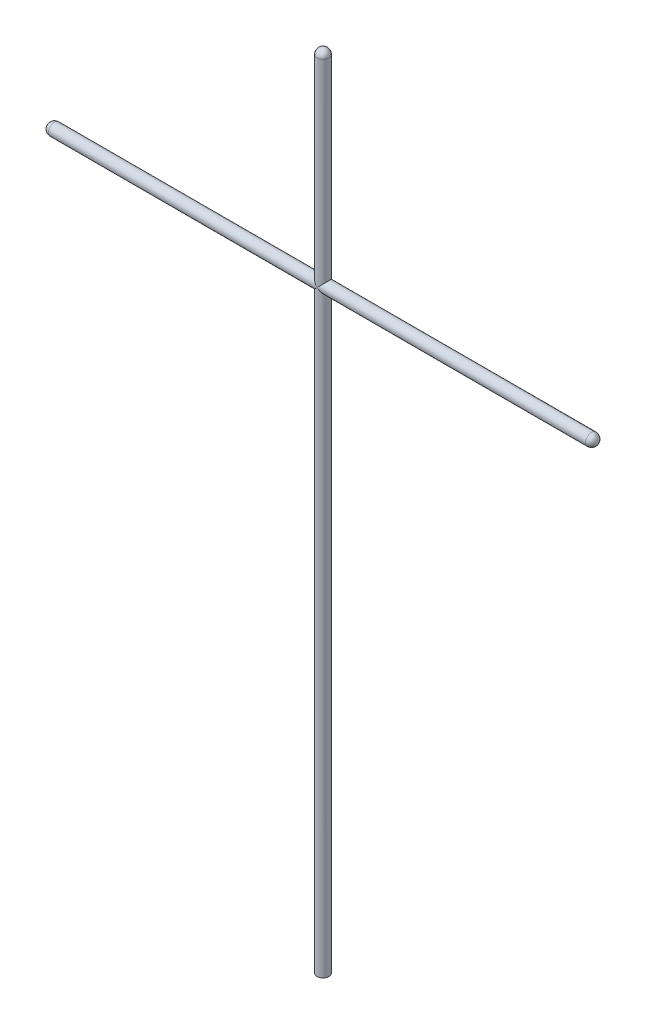
ISO-10303-21;
HEADER;
FILE_DESCRIPTION(('STEP AP214'),'2;1');
FILE_NAME('part.step','',(''),(''),'','','');
FILE_SCHEMA(('AUTOMOTIVE_DESIGN { 1 0 10303 214 1 1 1 1 }'));
ENDSEC;
DATA;
#1=APPLICATION_CONTEXT('core data for automotive mechanical design processes');
#2=APPLICATION_PROTOCOL_DEFINITION('international standard','automotive_design',2000,#1);
#3=PRODUCT_CONTEXT('',#1,'mechanical');
#4=PRODUCT('Part','Part','',(#3));
#5=PRODUCT_RELATED_PRODUCT_CATEGORY('part','',(#4));
#6=PRODUCT_DEFINITION_FORMATION('','',#4);
#7=PRODUCT_DEFINITION_CONTEXT('part definition',#1,'design');
#8=PRODUCT_DEFINITION('design','',#6,#7);
#9=PRODUCT_DEFINITION_SHAPE('','',#8);
#10=(LENGTH_UNIT() NAMED_UNIT(*) SI_UNIT(.MILLI.,.METRE.));
#11=(NAMED_UNIT(*) PLANE_ANGLE_UNIT() SI_UNIT($,.RADIAN.));
#12=(NAMED_UNIT(*) SI_UNIT($,.STERADIAN.) SOLID_ANGLE_UNIT());
#13=UNCERTAINTY_MEASURE_WITH_UNIT(LENGTH_MEASURE(1.E-05),#10,'distance_accuracy_value','');
#14=(GEOMETRIC_REPRESENTATION_CONTEXT(3) GLOBAL_UNCERTAINTY_ASSIGNED_CONTEXT((#13)) GLOBAL_UNIT_ASSIGNED_CONTEXT((#10,
#11,#12)) REPRESENTATION_CONTEXT('',''));
#15=CARTESIAN_POINT('',(0.,0.,0.));
#16=DIRECTION('',(0.,0.,1.));
#17=DIRECTION('',(1.,0.,0.));
#18=AXIS2_PLACEMENT_3D('',#15,#16,#17);
#19=CARTESIAN_POINT('',(0.,800.,0.));
#20=DIRECTION('',(0.,-1.,0.));
#21=DIRECTION('',(0.,0.,-1.));
#22=AXIS2_PLACEMENT_3D('',#19,#20,#21);
#23=CYLINDRICAL_SURFACE('',#22,6.);
#24=CARTESIAN_POINT('',(0.,800.,0.));
#25=DIRECTION('',(0.,1.,0.));
#26=DIRECTION('',(0.,0.,1.));
#27=AXIS2_PLACEMENT_3D('',#24,#25,#26);
#28=CIRCLE('',#27,6.);
#29=CARTESIAN_POINT('',(0.,800.,6.));
#30=VERTEX_POINT('',#29);
#31=EDGE_CURVE('E58',#30,#30,#28,.T.);
#32=ORIENTED_EDGE('',*,*,#31,.F.);
#33=EDGE_LOOP('',(#32));
#34=FACE_BOUND('',#33,.T.);
#35=CARTESIAN_POINT('',(0.,600.,0.));
#36=DIRECTION('',(-0.707106781186547,-0.707106781186547,0.));
#37=DIRECTION('',(0.707106781186547,-0.707106781186547,0.));
#38=AXIS2_PLACEMENT_3D('',#35,#36,#37);
#39=ELLIPSE('',#38,8.48528137423857,6.);
#40=CARTESIAN_POINT('',(0.,600.,6.));
#41=VERTEX_POINT('',#40);
#42=CARTESIAN_POINT('',(0.,600.,-6.));
#43=VERTEX_POINT('',#42);
#44=EDGE_CURVE('E42',#41,#43,#39,.T.);
#45=ORIENTED_EDGE('',*,*,#44,.F.);
#46=CARTESIAN_POINT('',(0.,600.,0.));
#47=DIRECTION('',(0.707106781186547,-0.707106781186547,0.));
#48=DIRECTION('',(-0.707106781186547,-0.707106781186547,0.));
#49=AXIS2_PLACEMENT_3D('',#46,#47,#48);
#50=ELLIPSE('',#49,8.48528137423857,6.);
#51=EDGE_CURVE('E54',#43,#41,#50,.T.);
#52=ORIENTED_EDGE('',*,*,#51,.F.);
#53=EDGE_LOOP('',(#45,#52));
#54=FACE_BOUND('',#53,.T.);
#55=ADVANCED_FACE('F34',(#34,#54),#23,.T.);
#56=CARTESIAN_POINT('',(270.,600.,0.));
#57=DIRECTION('',(-1.,0.,0.));
#58=DIRECTION('',(0.,0.,1.));
#59=AXIS2_PLACEMENT_3D('',#56,#57,#58);
#60=CYLINDRICAL_SURFACE('',#59,6.00000000000001);
#61=CARTESIAN_POINT('',(-270.,600.,0.));
#62=DIRECTION('',(-1.,0.,0.));
#63=DIRECTION('',(0.,0.,1.));
#64=AXIS2_PLACEMENT_3D('',#61,#62,#63);
#65=CIRCLE('',#64,6.00000000000001);
#66=CARTESIAN_POINT('',(-270.,600.,6.00000000000001));
#67=VERTEX_POINT('',#66);
#68=EDGE_CURVE('E93',#67,#67,#65,.T.);
#69=ORIENTED_EDGE('',*,*,#68,.F.);
#70=EDGE_LOOP('',(#69));
#71=FACE_BOUND('',#70,.T.);
#72=CARTESIAN_POINT('',(0.,600.,0.));
#73=DIRECTION('',(0.707106781186547,-0.707106781186547,0.));
#74=DIRECTION('',(-0.707106781186547,-0.707106781186547,0.));
#75=AXIS2_PLACEMENT_3D('',#72,#73,#74);
#76=ELLIPSE('',#75,8.48528137423857,6.);
#77=EDGE_CURVE('E48',#43,#41,#76,.F.);
#78=ORIENTED_EDGE('',*,*,#77,.T.);
#79=ORIENTED_EDGE('',*,*,#44,.T.);
#80=EDGE_LOOP('',(#78,#79));
#81=FACE_BOUND('',#80,.T.);
#82=ADVANCED_FACE('F60',(#71,#81),#60,.T.);
#83=CARTESIAN_POINT('',(0.,0.,0.));
#84=DIRECTION('',(0.,1.,0.));
#85=DIRECTION('',(0.,0.,1.));
#86=AXIS2_PLACEMENT_3D('',#83,#84,#85);
#87=PLANE('',#86);
#88=CARTESIAN_POINT('',(0.,0.,0.));
#89=DIRECTION('',(0.,1.,0.));
#90=DIRECTION('',(0.,0.,1.));
#91=AXIS2_PLACEMENT_3D('',#88,#89,#90);
#92=CIRCLE('',#91,6.);
#93=CARTESIAN_POINT('',(0.,0.,6.));
#94=VERTEX_POINT('',#93);
#95=EDGE_CURVE('E85',#94,#94,#92,.T.);
#96=ORIENTED_EDGE('',*,*,#95,.F.);
#97=EDGE_LOOP('',(#96));
#98=FACE_BOUND('',#97,.T.);
#99=ADVANCED_FACE('F73',(#98),#87,.F.);
#100=ORIENTED_EDGE('',*,*,#95,.T.);
#101=EDGE_LOOP('',(#100));
#102=FACE_BOUND('',#101,.T.);
#103=CARTESIAN_POINT('',(0.,600.,0.));
#104=DIRECTION('',(-0.707106781186547,-0.707106781186547,0.));
#105=DIRECTION('',(0.707106781186547,-0.707106781186547,0.));
#106=AXIS2_PLACEMENT_3D('',#103,#104,#105);
#107=ELLIPSE('',#106,8.48528137423857,6.);
#108=EDGE_CURVE('E11',#41,#43,#107,.F.);
#109=ORIENTED_EDGE('',*,*,#108,.F.);
#110=ORIENTED_EDGE('',*,*,#77,.F.);
#111=EDGE_LOOP('',(#109,#110));
#112=FACE_BOUND('',#111,.T.);
#113=ADVANCED_FACE('F36',(#102,#112),#23,.T.);
#114=CARTESIAN_POINT('',(270.,600.,0.));
#115=DIRECTION('',(1.,0.,0.));
#116=DIRECTION('',(0.,0.,-1.));
#117=AXIS2_PLACEMENT_3D('',#114,#115,#116);
#118=CIRCLE('',#117,6.00000000000001);
#119=CARTESIAN_POINT('',(270.,600.,-6.00000000000001));
#120=VERTEX_POINT('',#119);
#121=EDGE_CURVE('E88',#120,#120,#118,.T.);
#122=ORIENTED_EDGE('',*,*,#121,.F.);
#123=EDGE_LOOP('',(#122));
#124=FACE_BOUND('',#123,.T.);
#125=ORIENTED_EDGE('',*,*,#51,.T.);
#126=ORIENTED_EDGE('',*,*,#108,.T.);
#127=EDGE_LOOP('',(#125,#126));
#128=FACE_BOUND('',#127,.T.);
#129=ADVANCED_FACE('F61',(#124,#128),#60,.T.);
#130=CARTESIAN_POINT('',(270.,600.,0.));
#131=DIRECTION('',(0.,1.,0.));
#132=DIRECTION('',(0.,0.,1.));
#133=AXIS2_PLACEMENT_3D('',#130,#131,#132);
#134=SPHERICAL_SURFACE('',#133,6.00000000000001);
#135=CARTESIAN_POINT('',(270.,600.,0.));
#136=DIRECTION('',(1.,0.,0.));
#137=DIRECTION('',(0.,0.,-1.));
#138=AXIS2_PLACEMENT_3D('',#135,#136,#137);
#139=SPHERICAL_SURFACE('',#138,6.00000000000001);
#140=ORIENTED_EDGE('',*,*,#121,.T.);
#141=EDGE_LOOP('',(#140));
#142=FACE_BOUND('',#141,.T.);
#143=ADVANCED_FACE('F63',(#142),#139,.T.);
#144=CARTESIAN_POINT('',(0.,800.,0.));
#145=DIRECTION('',(0.,0.,-1.));
#146=DIRECTION('',(-1.,0.,0.));
#147=AXIS2_PLACEMENT_3D('',#144,#145,#146);
#148=SPHERICAL_SURFACE('',#147,6.);
#149=CARTESIAN_POINT('',(0.,800.,0.));
#150=DIRECTION('',(0.,1.,0.));
#151=DIRECTION('',(0.,0.,1.));
#152=AXIS2_PLACEMENT_3D('',#149,#150,#151);
#153=SPHERICAL_SURFACE('',#152,6.);
#154=ORIENTED_EDGE('',*,*,#31,.T.);
#155=EDGE_LOOP('',(#154));
#156=FACE_BOUND('',#155,.T.);
#157=ADVANCED_FACE('F70',(#156),#153,.T.);
#158=CARTESIAN_POINT('',(-270.,600.,0.));
#159=DIRECTION('',(0.,1.,0.));
#160=DIRECTION('',(0.,0.,1.));
#161=AXIS2_PLACEMENT_3D('',#158,#159,#160);
#162=SPHERICAL_SURFACE('',#161,6.00000000000001);
#163=CARTESIAN_POINT('',(-270.,600.,0.));
#164=DIRECTION('',(-1.,0.,0.));
#165=DIRECTION('',(0.,0.,1.));
#166=AXIS2_PLACEMENT_3D('',#163,#164,#165);
#167=SPHERICAL_SURFACE('',#166,6.00000000000001);
#168=ORIENTED_EDGE('',*,*,#68,.T.);
#169=EDGE_LOOP('',(#168));
#170=FACE_BOUND('',#169,.T.);
#171=ADVANCED_FACE('F97',(#170),#167,.T.);
#172=CLOSED_SHELL('',(#55,#82,#99,#113,#129,#143,#157,#171));
#173=MANIFOLD_SOLID_BREP('B2',#172);
#174=ADVANCED_BREP_SHAPE_REPRESENTATION('',(#18,#173),#14);
#175=SHAPE_DEFINITION_REPRESENTATION(#9,#174);
ENDSEC;
END-ISO-10303-21;
